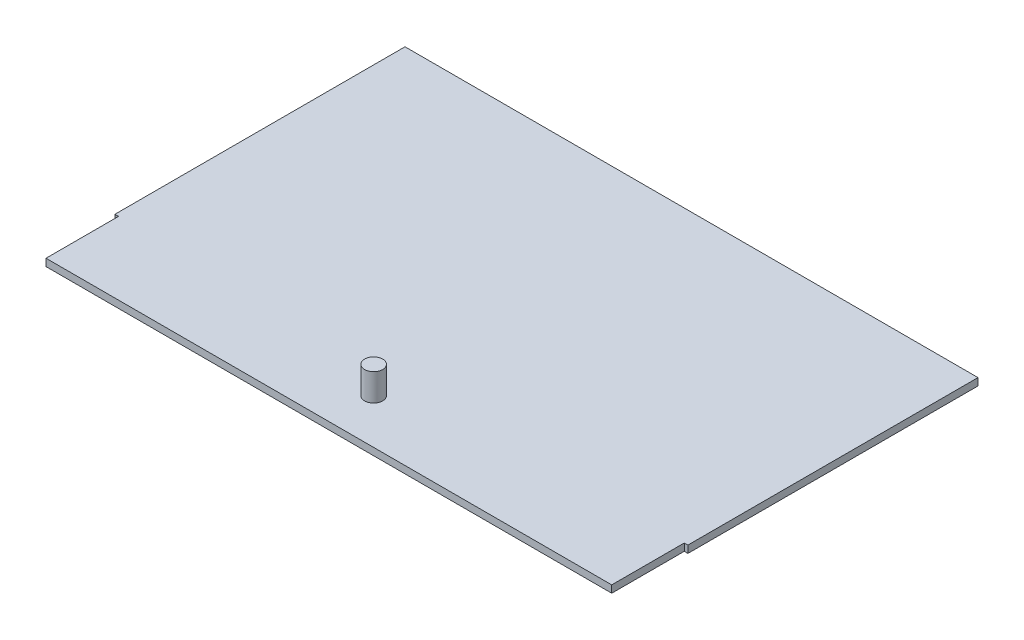
ISO-10303-21;
HEADER;
FILE_DESCRIPTION(('STEP AP214'),'2;1');
FILE_NAME('part.step','',(''),(''),'','','');
FILE_SCHEMA(('AUTOMOTIVE_DESIGN { 1 0 10303 214 1 1 1 1 }'));
ENDSEC;
DATA;
#1=APPLICATION_CONTEXT('core data for automotive mechanical design processes');
#2=APPLICATION_PROTOCOL_DEFINITION('international standard','automotive_design',2000,#1);
#3=PRODUCT_CONTEXT('',#1,'mechanical');
#4=PRODUCT('Part','Part','',(#3));
#5=PRODUCT_RELATED_PRODUCT_CATEGORY('part','',(#4));
#6=PRODUCT_DEFINITION_FORMATION('','',#4);
#7=PRODUCT_DEFINITION_CONTEXT('part definition',#1,'design');
#8=PRODUCT_DEFINITION('design','',#6,#7);
#9=PRODUCT_DEFINITION_SHAPE('','',#8);
#10=(LENGTH_UNIT() NAMED_UNIT(*) SI_UNIT(.MILLI.,.METRE.));
#11=(NAMED_UNIT(*) PLANE_ANGLE_UNIT() SI_UNIT($,.RADIAN.));
#12=(NAMED_UNIT(*) SI_UNIT($,.STERADIAN.) SOLID_ANGLE_UNIT());
#13=UNCERTAINTY_MEASURE_WITH_UNIT(LENGTH_MEASURE(1.E-05),#10,'distance_accuracy_value','');
#14=(GEOMETRIC_REPRESENTATION_CONTEXT(3) GLOBAL_UNCERTAINTY_ASSIGNED_CONTEXT((#13)) GLOBAL_UNIT_ASSIGNED_CONTEXT((#10,
#11,#12)) REPRESENTATION_CONTEXT('',''));
#15=CARTESIAN_POINT('',(0.,0.,0.));
#16=DIRECTION('',(0.,0.,1.));
#17=DIRECTION('',(1.,0.,0.));
#18=AXIS2_PLACEMENT_3D('',#15,#16,#17);
#19=CARTESIAN_POINT('',(-5.47604166666668,2.,-107.710069444444));
#20=DIRECTION('',(0.,0.,1.));
#21=DIRECTION('',(1.,0.,0.));
#22=AXIS2_PLACEMENT_3D('',#19,#20,#21);
#23=PLANE('',#22);
#24=DIRECTION('',(-1.,0.,0.));
#25=VECTOR('',#24,1.);
#26=CARTESIAN_POINT('',(-5.47604166666668,0.,-107.710069444444));
#27=LINE('',#26,#25);
#28=CARTESIAN_POINT('',(152.523958333333,0.,-107.710069444444));
#29=VERTEX_POINT('',#28);
#30=CARTESIAN_POINT('',(-5.47604166666668,0.,-107.710069444444));
#31=VERTEX_POINT('',#30);
#32=EDGE_CURVE('E129',#29,#31,#27,.T.);
#33=ORIENTED_EDGE('',*,*,#32,.T.);
#34=DIRECTION('',(0.,-1.,0.));
#35=VECTOR('',#34,1.);
#36=CARTESIAN_POINT('',(-5.47604166666668,2.,-107.710069444444));
#37=LINE('',#36,#35);
#38=CARTESIAN_POINT('',(-5.47604166666668,2.,-107.710069444444));
#39=VERTEX_POINT('',#38);
#40=EDGE_CURVE('E40',#39,#31,#37,.T.);
#41=ORIENTED_EDGE('',*,*,#40,.F.);
#42=DIRECTION('',(-1.,0.,0.));
#43=VECTOR('',#42,1.);
#44=CARTESIAN_POINT('',(-5.47604166666668,2.,-107.710069444444));
#45=LINE('',#44,#43);
#46=CARTESIAN_POINT('',(152.523958333333,2.,-107.710069444444));
#47=VERTEX_POINT('',#46);
#48=EDGE_CURVE('E144',#47,#39,#45,.T.);
#49=ORIENTED_EDGE('',*,*,#48,.F.);
#50=DIRECTION('',(0.,-1.,0.));
#51=VECTOR('',#50,1.);
#52=CARTESIAN_POINT('',(152.523958333333,2.,-107.710069444444));
#53=LINE('',#52,#51);
#54=EDGE_CURVE('E125',#47,#29,#53,.T.);
#55=ORIENTED_EDGE('',*,*,#54,.T.);
#56=EDGE_LOOP('',(#33,#41,#49,#55));
#57=FACE_BOUND('',#56,.T.);
#58=ADVANCED_FACE('F32',(#57),#23,.F.);
#59=CARTESIAN_POINT('',(-5.47604166666668,2.,-107.710069444444));
#60=DIRECTION('',(1.,0.,0.));
#61=DIRECTION('',(0.,0.,-1.));
#62=AXIS2_PLACEMENT_3D('',#59,#60,#61);
#63=PLANE('',#62);
#64=DIRECTION('',(0.,0.,1.));
#65=VECTOR('',#64,1.);
#66=CARTESIAN_POINT('',(-5.47604166666668,0.,-107.710069444444));
#67=LINE('',#66,#65);
#68=CARTESIAN_POINT('',(-5.47604166666667,0.,-27.7100694444444));
#69=VERTEX_POINT('',#68);
#70=EDGE_CURVE('E132',#31,#69,#67,.T.);
#71=ORIENTED_EDGE('',*,*,#70,.T.);
#72=DIRECTION('',(0.,-1.,0.));
#73=VECTOR('',#72,1.);
#74=CARTESIAN_POINT('',(-5.47604166666667,2.,-27.7100694444444));
#75=LINE('',#74,#73);
#76=CARTESIAN_POINT('',(-5.47604166666667,2.,-27.7100694444444));
#77=VERTEX_POINT('',#76);
#78=EDGE_CURVE('E154',#77,#69,#75,.T.);
#79=ORIENTED_EDGE('',*,*,#78,.F.);
#80=DIRECTION('',(0.,0.,1.));
#81=VECTOR('',#80,1.);
#82=CARTESIAN_POINT('',(-5.47604166666668,2.,-107.710069444444));
#83=LINE('',#82,#81);
#84=EDGE_CURVE('E92',#39,#77,#83,.T.);
#85=ORIENTED_EDGE('',*,*,#84,.F.);
#86=ORIENTED_EDGE('',*,*,#40,.T.);
#87=EDGE_LOOP('',(#71,#79,#85,#86));
#88=FACE_BOUND('',#87,.T.);
#89=ADVANCED_FACE('F157',(#88),#63,.F.);
#90=CARTESIAN_POINT('',(-5.47604166666667,2.,-27.7100694444444));
#91=DIRECTION('',(0.,0.,-1.));
#92=DIRECTION('',(-1.,0.,0.));
#93=AXIS2_PLACEMENT_3D('',#90,#91,#92);
#94=PLANE('',#93);
#95=DIRECTION('',(1.,0.,0.));
#96=VECTOR('',#95,1.);
#97=CARTESIAN_POINT('',(-5.47604166666667,0.,-27.7100694444444));
#98=LINE('',#97,#96);
#99=CARTESIAN_POINT('',(-4.47604166666667,0.,-27.7100694444444));
#100=VERTEX_POINT('',#99);
#101=EDGE_CURVE('E135',#69,#100,#98,.T.);
#102=ORIENTED_EDGE('',*,*,#101,.T.);
#103=DIRECTION('',(0.,-1.,0.));
#104=VECTOR('',#103,1.);
#105=CARTESIAN_POINT('',(-4.47604166666667,2.,-27.7100694444444));
#106=LINE('',#105,#104);
#107=CARTESIAN_POINT('',(-4.47604166666667,2.,-27.7100694444444));
#108=VERTEX_POINT('',#107);
#109=EDGE_CURVE('E151',#108,#100,#106,.T.);
#110=ORIENTED_EDGE('',*,*,#109,.F.);
#111=DIRECTION('',(1.,0.,0.));
#112=VECTOR('',#111,1.);
#113=CARTESIAN_POINT('',(-5.47604166666667,2.,-27.7100694444444));
#114=LINE('',#113,#112);
#115=EDGE_CURVE('E175',#77,#108,#114,.T.);
#116=ORIENTED_EDGE('',*,*,#115,.F.);
#117=ORIENTED_EDGE('',*,*,#78,.T.);
#118=EDGE_LOOP('',(#102,#110,#116,#117));
#119=FACE_BOUND('',#118,.T.);
#120=ADVANCED_FACE('F168',(#119),#94,.F.);
#121=CARTESIAN_POINT('',(-4.47604166666667,2.,-27.7100694444444));
#122=DIRECTION('',(1.,0.,0.));
#123=DIRECTION('',(0.,0.,-1.));
#124=AXIS2_PLACEMENT_3D('',#121,#122,#123);
#125=PLANE('',#124);
#126=DIRECTION('',(0.,0.,1.));
#127=VECTOR('',#126,1.);
#128=CARTESIAN_POINT('',(-4.47604166666667,0.,-27.7100694444444));
#129=LINE('',#128,#127);
#130=CARTESIAN_POINT('',(-4.47604166666667,0.,-7.71006944444444));
#131=VERTEX_POINT('',#130);
#132=EDGE_CURVE('E137',#100,#131,#129,.T.);
#133=ORIENTED_EDGE('',*,*,#132,.T.);
#134=DIRECTION('',(0.,-1.,0.));
#135=VECTOR('',#134,1.);
#136=CARTESIAN_POINT('',(-4.47604166666667,2.,-7.71006944444444));
#137=LINE('',#136,#135);
#138=CARTESIAN_POINT('',(-4.47604166666667,2.,-7.71006944444444));
#139=VERTEX_POINT('',#138);
#140=EDGE_CURVE('E148',#139,#131,#137,.T.);
#141=ORIENTED_EDGE('',*,*,#140,.F.);
#142=DIRECTION('',(0.,0.,1.));
#143=VECTOR('',#142,1.);
#144=CARTESIAN_POINT('',(-4.47604166666667,2.,-27.7100694444444));
#145=LINE('',#144,#143);
#146=EDGE_CURVE('E174',#108,#139,#145,.T.);
#147=ORIENTED_EDGE('',*,*,#146,.F.);
#148=ORIENTED_EDGE('',*,*,#109,.T.);
#149=EDGE_LOOP('',(#133,#141,#147,#148));
#150=FACE_BOUND('',#149,.T.);
#151=ADVANCED_FACE('F172',(#150),#125,.F.);
#152=CARTESIAN_POINT('',(-4.47604166666667,2.,-7.71006944444444));
#153=DIRECTION('',(0.,0.,-1.));
#154=DIRECTION('',(-1.,0.,0.));
#155=AXIS2_PLACEMENT_3D('',#152,#153,#154);
#156=PLANE('',#155);
#157=DIRECTION('',(1.,0.,0.));
#158=VECTOR('',#157,1.);
#159=CARTESIAN_POINT('',(-4.47604166666667,0.,-7.71006944444444));
#160=LINE('',#159,#158);
#161=CARTESIAN_POINT('',(151.523958333333,0.,-7.71006944444444));
#162=VERTEX_POINT('',#161);
#163=EDGE_CURVE('E139',#131,#162,#160,.T.);
#164=ORIENTED_EDGE('',*,*,#163,.T.);
#165=DIRECTION('',(0.,-1.,0.));
#166=VECTOR('',#165,1.);
#167=CARTESIAN_POINT('',(151.523958333333,2.,-7.71006944444444));
#168=LINE('',#167,#166);
#169=CARTESIAN_POINT('',(151.523958333333,2.,-7.71006944444444));
#170=VERTEX_POINT('',#169);
#171=EDGE_CURVE('E120',#170,#162,#168,.T.);
#172=ORIENTED_EDGE('',*,*,#171,.F.);
#173=DIRECTION('',(1.,0.,0.));
#174=VECTOR('',#173,1.);
#175=CARTESIAN_POINT('',(-4.47604166666667,2.,-7.71006944444444));
#176=LINE('',#175,#174);
#177=EDGE_CURVE('E111',#139,#170,#176,.T.);
#178=ORIENTED_EDGE('',*,*,#177,.F.);
#179=ORIENTED_EDGE('',*,*,#140,.T.);
#180=EDGE_LOOP('',(#164,#172,#178,#179));
#181=FACE_BOUND('',#180,.T.);
#182=ADVANCED_FACE('F212',(#181),#156,.F.);
#183=CARTESIAN_POINT('',(151.523958333333,2.,-27.7100694444444));
#184=DIRECTION('',(-1.,0.,0.));
#185=DIRECTION('',(0.,0.,1.));
#186=AXIS2_PLACEMENT_3D('',#183,#184,#185);
#187=PLANE('',#186);
#188=DIRECTION('',(0.,0.,-1.));
#189=VECTOR('',#188,1.);
#190=CARTESIAN_POINT('',(151.523958333333,0.,-27.7100694444444));
#191=LINE('',#190,#189);
#192=CARTESIAN_POINT('',(151.523958333333,0.,-27.7100694444444));
#193=VERTEX_POINT('',#192);
#194=EDGE_CURVE('E119',#162,#193,#191,.T.);
#195=ORIENTED_EDGE('',*,*,#194,.T.);
#196=DIRECTION('',(0.,-1.,0.));
#197=VECTOR('',#196,1.);
#198=CARTESIAN_POINT('',(151.523958333333,2.,-27.7100694444444));
#199=LINE('',#198,#197);
#200=CARTESIAN_POINT('',(151.523958333333,2.,-27.7100694444444));
#201=VERTEX_POINT('',#200);
#202=EDGE_CURVE('E116',#201,#193,#199,.T.);
#203=ORIENTED_EDGE('',*,*,#202,.F.);
#204=DIRECTION('',(0.,0.,-1.));
#205=VECTOR('',#204,1.);
#206=CARTESIAN_POINT('',(151.523958333333,2.,-27.7100694444444));
#207=LINE('',#206,#205);
#208=EDGE_CURVE('E105',#170,#201,#207,.T.);
#209=ORIENTED_EDGE('',*,*,#208,.F.);
#210=ORIENTED_EDGE('',*,*,#171,.T.);
#211=EDGE_LOOP('',(#195,#203,#209,#210));
#212=FACE_BOUND('',#211,.T.);
#213=ADVANCED_FACE('F117',(#212),#187,.F.);
#214=CARTESIAN_POINT('',(152.523958333333,2.,-27.7100694444444));
#215=DIRECTION('',(0.,0.,-1.));
#216=DIRECTION('',(-1.,0.,0.));
#217=AXIS2_PLACEMENT_3D('',#214,#215,#216);
#218=PLANE('',#217);
#219=DIRECTION('',(1.,0.,0.));
#220=VECTOR('',#219,1.);
#221=CARTESIAN_POINT('',(152.523958333333,0.,-27.7100694444444));
#222=LINE('',#221,#220);
#223=CARTESIAN_POINT('',(152.523958333333,0.,-27.7100694444444));
#224=VERTEX_POINT('',#223);
#225=EDGE_CURVE('E77',#193,#224,#222,.T.);
#226=ORIENTED_EDGE('',*,*,#225,.T.);
#227=DIRECTION('',(0.,-1.,0.));
#228=VECTOR('',#227,1.);
#229=CARTESIAN_POINT('',(152.523958333333,2.,-27.7100694444444));
#230=LINE('',#229,#228);
#231=CARTESIAN_POINT('',(152.523958333333,2.,-27.7100694444444));
#232=VERTEX_POINT('',#231);
#233=EDGE_CURVE('E121',#232,#224,#230,.T.);
#234=ORIENTED_EDGE('',*,*,#233,.F.);
#235=DIRECTION('',(1.,0.,0.));
#236=VECTOR('',#235,1.);
#237=CARTESIAN_POINT('',(152.523958333333,2.,-27.7100694444444));
#238=LINE('',#237,#236);
#239=EDGE_CURVE('E109',#201,#232,#238,.T.);
#240=ORIENTED_EDGE('',*,*,#239,.F.);
#241=ORIENTED_EDGE('',*,*,#202,.T.);
#242=EDGE_LOOP('',(#226,#234,#240,#241));
#243=FACE_BOUND('',#242,.T.);
#244=ADVANCED_FACE('F123',(#243),#218,.F.);
#245=CARTESIAN_POINT('',(152.523958333333,2.,-107.710069444444));
#246=DIRECTION('',(-1.,0.,0.));
#247=DIRECTION('',(0.,0.,1.));
#248=AXIS2_PLACEMENT_3D('',#245,#246,#247);
#249=PLANE('',#248);
#250=DIRECTION('',(0.,0.,-1.));
#251=VECTOR('',#250,1.);
#252=CARTESIAN_POINT('',(152.523958333333,0.,-107.710069444444));
#253=LINE('',#252,#251);
#254=EDGE_CURVE('E83',#224,#29,#253,.T.);
#255=ORIENTED_EDGE('',*,*,#254,.T.);
#256=ORIENTED_EDGE('',*,*,#54,.F.);
#257=DIRECTION('',(0.,0.,-1.));
#258=VECTOR('',#257,1.);
#259=CARTESIAN_POINT('',(152.523958333333,2.,-107.710069444444));
#260=LINE('',#259,#258);
#261=EDGE_CURVE('E48',#232,#47,#260,.T.);
#262=ORIENTED_EDGE('',*,*,#261,.F.);
#263=ORIENTED_EDGE('',*,*,#233,.T.);
#264=EDGE_LOOP('',(#255,#256,#262,#263));
#265=FACE_BOUND('',#264,.T.);
#266=ADVANCED_FACE('F193',(#265),#249,.F.);
#267=CARTESIAN_POINT('',(0.,2.,0.));
#268=DIRECTION('',(0.,-1.,0.));
#269=DIRECTION('',(0.,0.,-1.));
#270=AXIS2_PLACEMENT_3D('',#267,#268,#269);
#271=PLANE('',#270);
#272=CARTESIAN_POINT('',(73.5239583333333,2.,-20.0582827805493));
#273=DIRECTION('',(0.,-1.,0.));
#274=DIRECTION('',(0.,0.,-1.));
#275=AXIS2_PLACEMENT_3D('',#272,#273,#274);
#276=CIRCLE('',#275,2.50000000000001);
#277=CARTESIAN_POINT('',(73.5239583333333,2.,-22.5582827805493));
#278=VERTEX_POINT('',#277);
#279=EDGE_CURVE('E11',#278,#278,#276,.F.);
#280=ORIENTED_EDGE('',*,*,#279,.F.);
#281=EDGE_LOOP('',(#280));
#282=FACE_BOUND('',#281,.T.);
#283=ORIENTED_EDGE('',*,*,#48,.T.);
#284=ORIENTED_EDGE('',*,*,#84,.T.);
#285=ORIENTED_EDGE('',*,*,#115,.T.);
#286=ORIENTED_EDGE('',*,*,#146,.T.);
#287=ORIENTED_EDGE('',*,*,#177,.T.);
#288=ORIENTED_EDGE('',*,*,#208,.T.);
#289=ORIENTED_EDGE('',*,*,#239,.T.);
#290=ORIENTED_EDGE('',*,*,#261,.T.);
#291=EDGE_LOOP('',(#283,#284,#285,#286,#287,#288,#289,#290));
#292=FACE_BOUND('',#291,.T.);
#293=ADVANCED_FACE('F107',(#282,#292),#271,.F.);
#294=CARTESIAN_POINT('',(0.,0.,0.));
#295=DIRECTION('',(0.,-1.,0.));
#296=DIRECTION('',(0.,0.,-1.));
#297=AXIS2_PLACEMENT_3D('',#294,#295,#296);
#298=PLANE('',#297);
#299=ORIENTED_EDGE('',*,*,#32,.F.);
#300=ORIENTED_EDGE('',*,*,#254,.F.);
#301=ORIENTED_EDGE('',*,*,#225,.F.);
#302=ORIENTED_EDGE('',*,*,#194,.F.);
#303=ORIENTED_EDGE('',*,*,#163,.F.);
#304=ORIENTED_EDGE('',*,*,#132,.F.);
#305=ORIENTED_EDGE('',*,*,#101,.F.);
#306=ORIENTED_EDGE('',*,*,#70,.F.);
#307=EDGE_LOOP('',(#299,#300,#301,#302,#303,#304,#305,#306));
#308=FACE_BOUND('',#307,.T.);
#309=ADVANCED_FACE('F162',(#308),#298,.T.);
#310=CARTESIAN_POINT('',(73.5239583333333,9.5,-20.0582827805493));
#311=DIRECTION('',(0.,-1.,0.));
#312=DIRECTION('',(0.,0.,-1.));
#313=AXIS2_PLACEMENT_3D('',#310,#311,#312);
#314=CYLINDRICAL_SURFACE('',#313,2.50000000000001);
#315=CARTESIAN_POINT('',(73.5239583333333,9.5,-20.0582827805493));
#316=DIRECTION('',(0.,1.,0.));
#317=DIRECTION('',(0.,0.,1.));
#318=AXIS2_PLACEMENT_3D('',#315,#316,#317);
#319=CIRCLE('',#318,2.50000000000001);
#320=CARTESIAN_POINT('',(73.5239583333333,9.5,-17.5582827805493));
#321=VERTEX_POINT('',#320);
#322=EDGE_CURVE('E133',#321,#321,#319,.T.);
#323=ORIENTED_EDGE('',*,*,#322,.F.);
#324=EDGE_LOOP('',(#323));
#325=FACE_BOUND('',#324,.T.);
#326=ORIENTED_EDGE('',*,*,#279,.T.);
#327=EDGE_LOOP('',(#326));
#328=FACE_BOUND('',#327,.T.);
#329=ADVANCED_FACE('F186',(#325,#328),#314,.T.);
#330=CARTESIAN_POINT('',(73.5239583333333,9.5,-20.0582827805493));
#331=DIRECTION('',(0.,1.,0.));
#332=DIRECTION('',(0.,0.,1.));
#333=AXIS2_PLACEMENT_3D('',#330,#331,#332);
#334=PLANE('',#333);
#335=ORIENTED_EDGE('',*,*,#322,.T.);
#336=EDGE_LOOP('',(#335));
#337=FACE_BOUND('',#336,.T.);
#338=ADVANCED_FACE('F184',(#337),#334,.T.);
#339=CLOSED_SHELL('',(#58,#89,#120,#151,#182,#213,#244,#266,#293,#309,#329,#338));
#340=MANIFOLD_SOLID_BREP('B2',#339);
#341=ADVANCED_BREP_SHAPE_REPRESENTATION('',(#18,#340),#14);
#342=SHAPE_DEFINITION_REPRESENTATION(#9,#341);
ENDSEC;
END-ISO-10303-21;
